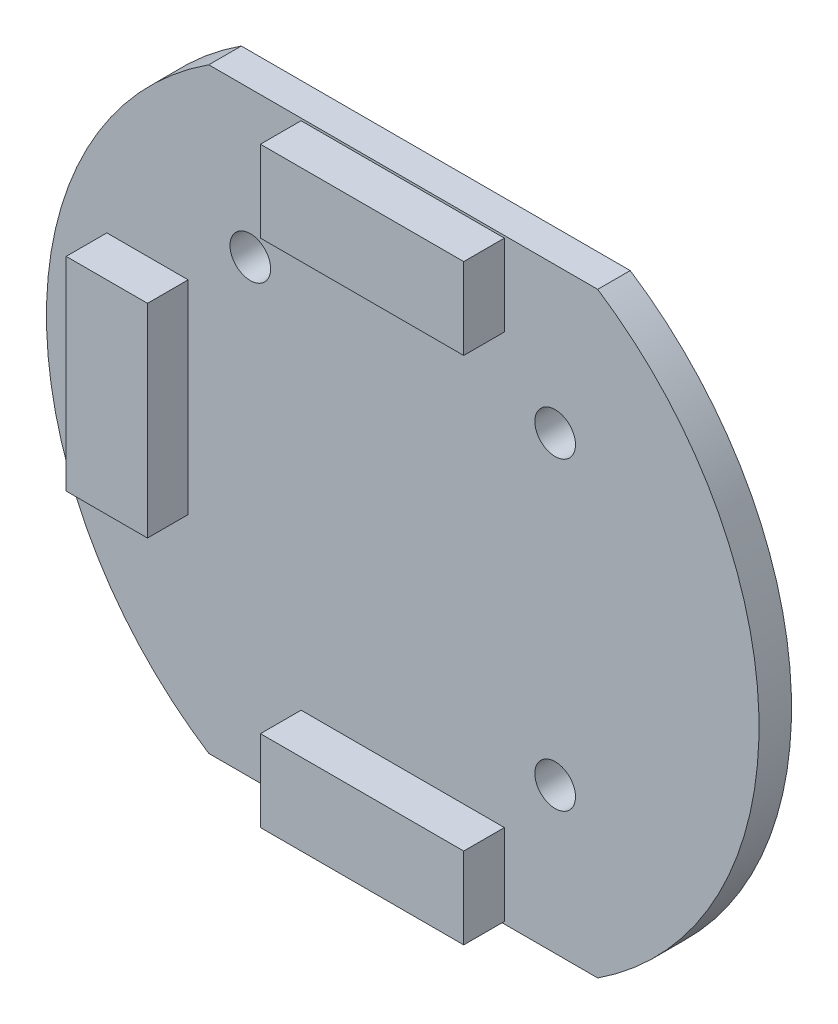
ISO-10303-21;
HEADER;
FILE_DESCRIPTION(('STEP AP214'),'2;1');
FILE_NAME('part.step','',(''),(''),'','','');
FILE_SCHEMA(('AUTOMOTIVE_DESIGN { 1 0 10303 214 1 1 1 1 }'));
ENDSEC;
DATA;
#1=APPLICATION_CONTEXT('core data for automotive mechanical design processes');
#2=APPLICATION_PROTOCOL_DEFINITION('international standard','automotive_design',2000,#1);
#3=PRODUCT_CONTEXT('',#1,'mechanical');
#4=PRODUCT('Part','Part','',(#3));
#5=PRODUCT_RELATED_PRODUCT_CATEGORY('part','',(#4));
#6=PRODUCT_DEFINITION_FORMATION('','',#4);
#7=PRODUCT_DEFINITION_CONTEXT('part definition',#1,'design');
#8=PRODUCT_DEFINITION('design','',#6,#7);
#9=PRODUCT_DEFINITION_SHAPE('','',#8);
#10=(LENGTH_UNIT() NAMED_UNIT(*) SI_UNIT(.MILLI.,.METRE.));
#11=(NAMED_UNIT(*) PLANE_ANGLE_UNIT() SI_UNIT($,.RADIAN.));
#12=(NAMED_UNIT(*) SI_UNIT($,.STERADIAN.) SOLID_ANGLE_UNIT());
#13=UNCERTAINTY_MEASURE_WITH_UNIT(LENGTH_MEASURE(1.E-05),#10,'distance_accuracy_value','');
#14=(GEOMETRIC_REPRESENTATION_CONTEXT(3) GLOBAL_UNCERTAINTY_ASSIGNED_CONTEXT((#13)) GLOBAL_UNIT_ASSIGNED_CONTEXT((#10,
#11,#12)) REPRESENTATION_CONTEXT('',''));
#15=CARTESIAN_POINT('',(0.,0.,0.));
#16=DIRECTION('',(0.,0.,1.));
#17=DIRECTION('',(1.,0.,0.));
#18=AXIS2_PLACEMENT_3D('',#15,#16,#17);
#19=CARTESIAN_POINT('',(-0.0597534019790239,0.,1.6));
#20=DIRECTION('',(0.,0.,1.));
#21=DIRECTION('',(1.,0.,0.));
#22=AXIS2_PLACEMENT_3D('',#19,#20,#21);
#23=PLANE('',#22);
#24=CARTESIAN_POINT('',(-7.49851386109271,7.49851386109278,1.6));
#25=DIRECTION('',(0.,0.,1.));
#26=DIRECTION('',(1.,0.,0.));
#27=AXIS2_PLACEMENT_3D('',#24,#25,#26);
#28=CIRCLE('',#27,1.);
#29=CARTESIAN_POINT('',(-6.49851386109271,7.49851386109278,1.6));
#30=VERTEX_POINT('',#29);
#31=EDGE_CURVE('E345',#30,#30,#28,.T.);
#32=ORIENTED_EDGE('',*,*,#31,.F.);
#33=EDGE_LOOP('',(#32));
#34=FACE_BOUND('',#33,.T.);
#35=CARTESIAN_POINT('',(-0.0597534019790239,0.,1.6));
#36=DIRECTION('',(0.,0.,1.));
#37=DIRECTION('',(1.,0.,0.));
#38=AXIS2_PLACEMENT_3D('',#35,#36,#37);
#39=CIRCLE('',#38,17.466246598021);
#40=CARTESIAN_POINT('',(-9.54157168608882,14.6685,1.6));
#41=VERTEX_POINT('',#40);
#42=CARTESIAN_POINT('',(-9.54157168608882,-14.6685,1.6));
#43=VERTEX_POINT('',#42);
#44=EDGE_CURVE('E361',#41,#43,#39,.T.);
#45=ORIENTED_EDGE('',*,*,#44,.T.);
#46=DIRECTION('',(1.,0.,0.));
#47=VECTOR('',#46,1.);
#48=CARTESIAN_POINT('',(9.59144325688267,-14.6685,1.6));
#49=LINE('',#48,#47);
#50=CARTESIAN_POINT('',(9.59144325688267,-14.6685,1.6));
#51=VERTEX_POINT('',#50);
#52=EDGE_CURVE('E365',#43,#51,#49,.T.);
#53=ORIENTED_EDGE('',*,*,#52,.T.);
#54=CARTESIAN_POINT('',(-3.19189119579733E-13,0.,1.6));
#55=DIRECTION('',(0.,0.,1.));
#56=DIRECTION('',(-1.,0.,0.));
#57=AXIS2_PLACEMENT_3D('',#54,#55,#56);
#58=CIRCLE('',#57,17.5260000000002);
#59=CARTESIAN_POINT('',(9.59144325688267,14.6685,1.6));
#60=VERTEX_POINT('',#59);
#61=EDGE_CURVE('E369',#51,#60,#58,.T.);
#62=ORIENTED_EDGE('',*,*,#61,.T.);
#63=DIRECTION('',(-1.,0.,0.));
#64=VECTOR('',#63,1.);
#65=CARTESIAN_POINT('',(-9.54157168608882,14.6685,1.6));
#66=LINE('',#65,#64);
#67=EDGE_CURVE('E372',#60,#41,#66,.T.);
#68=ORIENTED_EDGE('',*,*,#67,.T.);
#69=EDGE_LOOP('',(#45,#53,#62,#68));
#70=FACE_BOUND('',#69,.T.);
#71=CARTESIAN_POINT('',(7.49851386109276,-7.49851386109273,1.6));
#72=DIRECTION('',(0.,0.,1.));
#73=DIRECTION('',(1.,0.,0.));
#74=AXIS2_PLACEMENT_3D('',#71,#72,#73);
#75=CIRCLE('',#74,1.);
#76=CARTESIAN_POINT('',(8.49851386109276,-7.49851386109273,1.6));
#77=VERTEX_POINT('',#76);
#78=EDGE_CURVE('E353',#77,#77,#75,.T.);
#79=ORIENTED_EDGE('',*,*,#78,.F.);
#80=EDGE_LOOP('',(#79));
#81=FACE_BOUND('',#80,.T.);
#82=CARTESIAN_POINT('',(7.49851386109281,7.49851386109268,1.6));
#83=DIRECTION('',(0.,0.,1.));
#84=DIRECTION('',(1.,0.,0.));
#85=AXIS2_PLACEMENT_3D('',#82,#83,#84);
#86=CIRCLE('',#85,1.);
#87=CARTESIAN_POINT('',(8.49851386109281,7.49851386109268,1.6));
#88=VERTEX_POINT('',#87);
#89=EDGE_CURVE('E337',#88,#88,#86,.T.);
#90=ORIENTED_EDGE('',*,*,#89,.F.);
#91=EDGE_LOOP('',(#90));
#92=FACE_BOUND('',#91,.T.);
#93=DIRECTION('',(1.,0.,0.));
#94=VECTOR('',#93,1.);
#95=CARTESIAN_POINT('',(-5.,-14.555549105909,1.6));
#96=LINE('',#95,#94);
#97=CARTESIAN_POINT('',(-5.,-14.555549105909,1.6));
#98=VERTEX_POINT('',#97);
#99=CARTESIAN_POINT('',(5.,-14.555549105909,1.6));
#100=VERTEX_POINT('',#99);
#101=EDGE_CURVE('E269',#98,#100,#96,.T.);
#102=ORIENTED_EDGE('',*,*,#101,.F.);
#103=DIRECTION('',(0.,-1.,0.));
#104=VECTOR('',#103,1.);
#105=CARTESIAN_POINT('',(-5.,-10.555549105909,1.6));
#106=LINE('',#105,#104);
#107=CARTESIAN_POINT('',(-5.,-10.555549105909,1.6));
#108=VERTEX_POINT('',#107);
#109=EDGE_CURVE('E250',#108,#98,#106,.T.);
#110=ORIENTED_EDGE('',*,*,#109,.F.);
#111=DIRECTION('',(-1.,0.,0.));
#112=VECTOR('',#111,1.);
#113=CARTESIAN_POINT('',(-5.,-10.555549105909,1.6));
#114=LINE('',#113,#112);
#115=CARTESIAN_POINT('',(5.,-10.555549105909,1.6));
#116=VERTEX_POINT('',#115);
#117=EDGE_CURVE('E256',#116,#108,#114,.T.);
#118=ORIENTED_EDGE('',*,*,#117,.F.);
#119=DIRECTION('',(0.,1.,0.));
#120=VECTOR('',#119,1.);
#121=CARTESIAN_POINT('',(5.,-10.555549105909,1.6));
#122=LINE('',#121,#120);
#123=EDGE_CURVE('E272',#100,#116,#122,.T.);
#124=ORIENTED_EDGE('',*,*,#123,.F.);
#125=EDGE_LOOP('',(#102,#110,#118,#124));
#126=FACE_BOUND('',#125,.T.);
#127=DIRECTION('',(-1.,0.,0.));
#128=VECTOR('',#127,1.);
#129=CARTESIAN_POINT('',(-10.555549105909,5.00000000000004,1.6));
#130=LINE('',#129,#128);
#131=CARTESIAN_POINT('',(-10.555549105909,5.00000000000004,1.6));
#132=VERTEX_POINT('',#131);
#133=CARTESIAN_POINT('',(-14.555549105909,5.00000000000005,1.6));
#134=VERTEX_POINT('',#133);
#135=EDGE_CURVE('E211',#132,#134,#130,.T.);
#136=ORIENTED_EDGE('',*,*,#135,.F.);
#137=DIRECTION('',(0.,1.,0.));
#138=VECTOR('',#137,1.);
#139=CARTESIAN_POINT('',(-10.555549105909,5.00000000000004,1.6));
#140=LINE('',#139,#138);
#141=CARTESIAN_POINT('',(-10.555549105909,-4.99999999999996,1.6));
#142=VERTEX_POINT('',#141);
#143=EDGE_CURVE('E206',#142,#132,#140,.T.);
#144=ORIENTED_EDGE('',*,*,#143,.F.);
#145=DIRECTION('',(1.,0.,0.));
#146=VECTOR('',#145,1.);
#147=CARTESIAN_POINT('',(-10.555549105909,-4.99999999999996,1.6));
#148=LINE('',#147,#146);
#149=CARTESIAN_POINT('',(-14.555549105909,-4.99999999999995,1.6));
#150=VERTEX_POINT('',#149);
#151=EDGE_CURVE('E221',#150,#142,#148,.T.);
#152=ORIENTED_EDGE('',*,*,#151,.F.);
#153=DIRECTION('',(0.,-1.,0.));
#154=VECTOR('',#153,1.);
#155=CARTESIAN_POINT('',(-14.555549105909,5.00000000000005,1.6));
#156=LINE('',#155,#154);
#157=EDGE_CURVE('E233',#134,#150,#156,.T.);
#158=ORIENTED_EDGE('',*,*,#157,.F.);
#159=EDGE_LOOP('',(#136,#144,#152,#158));
#160=FACE_BOUND('',#159,.T.);
#161=DIRECTION('',(0.,1.,0.));
#162=VECTOR('',#161,1.);
#163=CARTESIAN_POINT('',(5.00000000000007,10.555549105909,1.6));
#164=LINE('',#163,#162);
#165=CARTESIAN_POINT('',(5.00000000000007,10.555549105909,1.6));
#166=VERTEX_POINT('',#165);
#167=CARTESIAN_POINT('',(5.0000000000001,14.555549105909,1.6));
#168=VERTEX_POINT('',#167);
#169=EDGE_CURVE('E463',#166,#168,#164,.T.);
#170=ORIENTED_EDGE('',*,*,#169,.F.);
#171=DIRECTION('',(1.,0.,0.));
#172=VECTOR('',#171,1.);
#173=CARTESIAN_POINT('',(5.00000000000007,10.555549105909,1.6));
#174=LINE('',#173,#172);
#175=CARTESIAN_POINT('',(-4.99999999999993,10.555549105909,1.6));
#176=VERTEX_POINT('',#175);
#177=EDGE_CURVE('E203',#176,#166,#174,.T.);
#178=ORIENTED_EDGE('',*,*,#177,.F.);
#179=DIRECTION('',(0.,-1.,0.));
#180=VECTOR('',#179,1.);
#181=CARTESIAN_POINT('',(-4.99999999999993,10.555549105909,1.6));
#182=LINE('',#181,#180);
#183=CARTESIAN_POINT('',(-4.9999999999999,14.555549105909,1.6));
#184=VERTEX_POINT('',#183);
#185=EDGE_CURVE('E199',#184,#176,#182,.T.);
#186=ORIENTED_EDGE('',*,*,#185,.F.);
#187=DIRECTION('',(-1.,0.,0.));
#188=VECTOR('',#187,1.);
#189=CARTESIAN_POINT('',(5.0000000000001,14.555549105909,1.6));
#190=LINE('',#189,#188);
#191=EDGE_CURVE('E465',#168,#184,#190,.T.);
#192=ORIENTED_EDGE('',*,*,#191,.F.);
#193=EDGE_LOOP('',(#170,#178,#186,#192));
#194=FACE_BOUND('',#193,.T.);
#195=ADVANCED_FACE('F39',(#34,#70,#81,#92,#126,#160,#194),#23,.T.);
#196=CARTESIAN_POINT('',(-0.0597534019790239,0.,0.));
#197=DIRECTION('',(0.,0.,1.));
#198=DIRECTION('',(1.,0.,0.));
#199=AXIS2_PLACEMENT_3D('',#196,#197,#198);
#200=PLANE('',#199);
#201=CARTESIAN_POINT('',(7.49851386109281,7.49851386109268,0.));
#202=DIRECTION('',(0.,0.,1.));
#203=DIRECTION('',(1.,0.,0.));
#204=AXIS2_PLACEMENT_3D('',#201,#202,#203);
#205=CIRCLE('',#204,1.);
#206=CARTESIAN_POINT('',(8.49851386109281,7.49851386109268,0.));
#207=VERTEX_POINT('',#206);
#208=EDGE_CURVE('E336',#207,#207,#205,.T.);
#209=ORIENTED_EDGE('',*,*,#208,.T.);
#210=EDGE_LOOP('',(#209));
#211=FACE_BOUND('',#210,.T.);
#212=CARTESIAN_POINT('',(-7.49851386109271,7.49851386109278,0.));
#213=DIRECTION('',(0.,0.,1.));
#214=DIRECTION('',(1.,0.,0.));
#215=AXIS2_PLACEMENT_3D('',#212,#213,#214);
#216=CIRCLE('',#215,1.);
#217=CARTESIAN_POINT('',(-6.49851386109271,7.49851386109278,0.));
#218=VERTEX_POINT('',#217);
#219=EDGE_CURVE('E341',#218,#218,#216,.T.);
#220=ORIENTED_EDGE('',*,*,#219,.T.);
#221=EDGE_LOOP('',(#220));
#222=FACE_BOUND('',#221,.T.);
#223=CARTESIAN_POINT('',(7.49851386109276,-7.49851386109273,0.));
#224=DIRECTION('',(0.,0.,1.));
#225=DIRECTION('',(1.,0.,0.));
#226=AXIS2_PLACEMENT_3D('',#223,#224,#225);
#227=CIRCLE('',#226,1.);
#228=CARTESIAN_POINT('',(8.49851386109276,-7.49851386109273,0.));
#229=VERTEX_POINT('',#228);
#230=EDGE_CURVE('E349',#229,#229,#227,.T.);
#231=ORIENTED_EDGE('',*,*,#230,.T.);
#232=EDGE_LOOP('',(#231));
#233=FACE_BOUND('',#232,.T.);
#234=CARTESIAN_POINT('',(-0.0597534019790239,0.,0.));
#235=DIRECTION('',(0.,0.,1.));
#236=DIRECTION('',(1.,0.,0.));
#237=AXIS2_PLACEMENT_3D('',#234,#235,#236);
#238=CIRCLE('',#237,17.466246598021);
#239=CARTESIAN_POINT('',(-9.54157168608882,14.6685,0.));
#240=VERTEX_POINT('',#239);
#241=CARTESIAN_POINT('',(-9.54157168608882,-14.6685,0.));
#242=VERTEX_POINT('',#241);
#243=EDGE_CURVE('E357',#240,#242,#238,.T.);
#244=ORIENTED_EDGE('',*,*,#243,.F.);
#245=DIRECTION('',(-1.,0.,0.));
#246=VECTOR('',#245,1.);
#247=CARTESIAN_POINT('',(-9.54157168608882,14.6685,0.));
#248=LINE('',#247,#246);
#249=CARTESIAN_POINT('',(9.59144325688267,14.6685,0.));
#250=VERTEX_POINT('',#249);
#251=EDGE_CURVE('E366',#250,#240,#248,.T.);
#252=ORIENTED_EDGE('',*,*,#251,.F.);
#253=CARTESIAN_POINT('',(-3.19189119579733E-13,0.,0.));
#254=DIRECTION('',(0.,0.,1.));
#255=DIRECTION('',(-1.,0.,0.));
#256=AXIS2_PLACEMENT_3D('',#253,#254,#255);
#257=CIRCLE('',#256,17.5260000000002);
#258=CARTESIAN_POINT('',(9.59144325688267,-14.6685,0.));
#259=VERTEX_POINT('',#258);
#260=EDGE_CURVE('E382',#259,#250,#257,.T.);
#261=ORIENTED_EDGE('',*,*,#260,.F.);
#262=DIRECTION('',(1.,0.,0.));
#263=VECTOR('',#262,1.);
#264=CARTESIAN_POINT('',(9.59144325688267,-14.6685,0.));
#265=LINE('',#264,#263);
#266=EDGE_CURVE('E379',#242,#259,#265,.T.);
#267=ORIENTED_EDGE('',*,*,#266,.F.);
#268=EDGE_LOOP('',(#244,#252,#261,#267));
#269=FACE_BOUND('',#268,.T.);
#270=DIRECTION('',(0.,1.,0.));
#271=VECTOR('',#270,1.);
#272=CARTESIAN_POINT('',(-0.888689787402086,1.81399359362899,0.));
#273=LINE('',#272,#271);
#274=CARTESIAN_POINT('',(-0.888689787402086,-1.81399359362899,0.));
#275=VERTEX_POINT('',#274);
#276=CARTESIAN_POINT('',(-0.888689787402086,1.81399359362899,0.));
#277=VERTEX_POINT('',#276);
#278=EDGE_CURVE('E291',#275,#277,#273,.T.);
#279=ORIENTED_EDGE('',*,*,#278,.F.);
#280=DIRECTION('',(-1.,0.,0.));
#281=VECTOR('',#280,1.);
#282=CARTESIAN_POINT('',(0.888689787402086,-1.81399359362899,0.));
#283=LINE('',#282,#281);
#284=CARTESIAN_POINT('',(0.888689787402086,-1.81399359362899,0.));
#285=VERTEX_POINT('',#284);
#286=EDGE_CURVE('E297',#285,#275,#283,.T.);
#287=ORIENTED_EDGE('',*,*,#286,.F.);
#288=DIRECTION('',(0.,-1.,0.));
#289=VECTOR('',#288,1.);
#290=CARTESIAN_POINT('',(0.888689787402086,1.81399359362899,0.));
#291=LINE('',#290,#289);
#292=CARTESIAN_POINT('',(0.888689787402086,1.81399359362899,0.));
#293=VERTEX_POINT('',#292);
#294=EDGE_CURVE('E314',#293,#285,#291,.T.);
#295=ORIENTED_EDGE('',*,*,#294,.F.);
#296=DIRECTION('',(1.,0.,0.));
#297=VECTOR('',#296,1.);
#298=CARTESIAN_POINT('',(0.888689787402086,1.81399359362899,0.));
#299=LINE('',#298,#297);
#300=EDGE_CURVE('E310',#277,#293,#299,.T.);
#301=ORIENTED_EDGE('',*,*,#300,.F.);
#302=EDGE_LOOP('',(#279,#287,#295,#301));
#303=FACE_BOUND('',#302,.T.);
#304=ADVANCED_FACE('F405',(#211,#222,#233,#269,#303),#200,.F.);
#305=CARTESIAN_POINT('',(-0.0597534019790239,0.,1.6));
#306=DIRECTION('',(0.,0.,-1.));
#307=DIRECTION('',(-1.,0.,0.));
#308=AXIS2_PLACEMENT_3D('',#305,#306,#307);
#309=CYLINDRICAL_SURFACE('',#308,17.466246598021);
#310=ORIENTED_EDGE('',*,*,#243,.T.);
#311=DIRECTION('',(0.,0.,-1.));
#312=VECTOR('',#311,1.);
#313=CARTESIAN_POINT('',(-9.54157168608882,-14.6685,1.6));
#314=LINE('',#313,#312);
#315=EDGE_CURVE('E11',#43,#242,#314,.T.);
#316=ORIENTED_EDGE('',*,*,#315,.F.);
#317=ORIENTED_EDGE('',*,*,#44,.F.);
#318=DIRECTION('',(0.,0.,-1.));
#319=VECTOR('',#318,1.);
#320=CARTESIAN_POINT('',(-9.54157168608882,14.6685,1.6));
#321=LINE('',#320,#319);
#322=EDGE_CURVE('E375',#41,#240,#321,.T.);
#323=ORIENTED_EDGE('',*,*,#322,.T.);
#324=EDGE_LOOP('',(#310,#316,#317,#323));
#325=FACE_BOUND('',#324,.T.);
#326=ADVANCED_FACE('F41',(#325),#309,.T.);
#327=CARTESIAN_POINT('',(9.59144325688267,-14.6685,1.6));
#328=DIRECTION('',(0.,1.,0.));
#329=DIRECTION('',(0.,0.,1.));
#330=AXIS2_PLACEMENT_3D('',#327,#328,#329);
#331=PLANE('',#330);
#332=ORIENTED_EDGE('',*,*,#266,.T.);
#333=DIRECTION('',(0.,0.,-1.));
#334=VECTOR('',#333,1.);
#335=CARTESIAN_POINT('',(9.59144325688267,-14.6685,1.6));
#336=LINE('',#335,#334);
#337=EDGE_CURVE('E48',#51,#259,#336,.T.);
#338=ORIENTED_EDGE('',*,*,#337,.F.);
#339=ORIENTED_EDGE('',*,*,#52,.F.);
#340=ORIENTED_EDGE('',*,*,#315,.T.);
#341=EDGE_LOOP('',(#332,#338,#339,#340));
#342=FACE_BOUND('',#341,.T.);
#343=ADVANCED_FACE('F416',(#342),#331,.F.);
#344=CARTESIAN_POINT('',(-3.19189119579733E-13,0.,1.6));
#345=DIRECTION('',(0.,0.,-1.));
#346=DIRECTION('',(-1.,0.,0.));
#347=AXIS2_PLACEMENT_3D('',#344,#345,#346);
#348=CYLINDRICAL_SURFACE('',#347,17.5260000000002);
#349=ORIENTED_EDGE('',*,*,#260,.T.);
#350=DIRECTION('',(0.,0.,-1.));
#351=VECTOR('',#350,1.);
#352=CARTESIAN_POINT('',(9.59144325688267,14.6685,1.6));
#353=LINE('',#352,#351);
#354=EDGE_CURVE('E390',#60,#250,#353,.T.);
#355=ORIENTED_EDGE('',*,*,#354,.F.);
#356=ORIENTED_EDGE('',*,*,#61,.F.);
#357=ORIENTED_EDGE('',*,*,#337,.T.);
#358=EDGE_LOOP('',(#349,#355,#356,#357));
#359=FACE_BOUND('',#358,.T.);
#360=ADVANCED_FACE('F399',(#359),#348,.T.);
#361=CARTESIAN_POINT('',(-9.54157168608882,14.6685,1.6));
#362=DIRECTION('',(0.,-1.,0.));
#363=DIRECTION('',(0.,0.,-1.));
#364=AXIS2_PLACEMENT_3D('',#361,#362,#363);
#365=PLANE('',#364);
#366=ORIENTED_EDGE('',*,*,#251,.T.);
#367=ORIENTED_EDGE('',*,*,#322,.F.);
#368=ORIENTED_EDGE('',*,*,#67,.F.);
#369=ORIENTED_EDGE('',*,*,#354,.T.);
#370=EDGE_LOOP('',(#366,#367,#368,#369));
#371=FACE_BOUND('',#370,.T.);
#372=ADVANCED_FACE('F409',(#371),#365,.F.);
#373=CARTESIAN_POINT('',(7.49851386109276,-7.49851386109273,1.6));
#374=DIRECTION('',(0.,0.,-1.));
#375=DIRECTION('',(-1.,0.,0.));
#376=AXIS2_PLACEMENT_3D('',#373,#374,#375);
#377=CYLINDRICAL_SURFACE('',#376,1.);
#378=ORIENTED_EDGE('',*,*,#78,.T.);
#379=EDGE_LOOP('',(#378));
#380=FACE_BOUND('',#379,.T.);
#381=ORIENTED_EDGE('',*,*,#230,.F.);
#382=EDGE_LOOP('',(#381));
#383=FACE_BOUND('',#382,.T.);
#384=ADVANCED_FACE('F433',(#380,#383),#377,.F.);
#385=CARTESIAN_POINT('',(-7.49851386109271,7.49851386109278,1.6));
#386=DIRECTION('',(0.,0.,-1.));
#387=DIRECTION('',(-1.,0.,0.));
#388=AXIS2_PLACEMENT_3D('',#385,#386,#387);
#389=CYLINDRICAL_SURFACE('',#388,1.);
#390=ORIENTED_EDGE('',*,*,#31,.T.);
#391=EDGE_LOOP('',(#390));
#392=FACE_BOUND('',#391,.T.);
#393=ORIENTED_EDGE('',*,*,#219,.F.);
#394=EDGE_LOOP('',(#393));
#395=FACE_BOUND('',#394,.T.);
#396=ADVANCED_FACE('F440',(#392,#395),#389,.F.);
#397=CARTESIAN_POINT('',(7.49851386109281,7.49851386109268,1.6));
#398=DIRECTION('',(0.,0.,-1.));
#399=DIRECTION('',(-1.,0.,0.));
#400=AXIS2_PLACEMENT_3D('',#397,#398,#399);
#401=CYLINDRICAL_SURFACE('',#400,1.);
#402=ORIENTED_EDGE('',*,*,#89,.T.);
#403=EDGE_LOOP('',(#402));
#404=FACE_BOUND('',#403,.T.);
#405=ORIENTED_EDGE('',*,*,#208,.F.);
#406=EDGE_LOOP('',(#405));
#407=FACE_BOUND('',#406,.T.);
#408=ADVANCED_FACE('F445',(#404,#407),#401,.F.);
#409=CARTESIAN_POINT('',(-0.888689787402086,1.81399359362899,-1.7));
#410=DIRECTION('',(1.,0.,0.));
#411=DIRECTION('',(0.,0.,-1.));
#412=AXIS2_PLACEMENT_3D('',#409,#410,#411);
#413=PLANE('',#412);
#414=ORIENTED_EDGE('',*,*,#278,.T.);
#415=DIRECTION('',(0.,0.,1.));
#416=VECTOR('',#415,1.);
#417=CARTESIAN_POINT('',(-0.888689787402086,1.81399359362899,-1.7));
#418=LINE('',#417,#416);
#419=CARTESIAN_POINT('',(-0.888689787402086,1.81399359362899,-1.7));
#420=VERTEX_POINT('',#419);
#421=EDGE_CURVE('E332',#420,#277,#418,.T.);
#422=ORIENTED_EDGE('',*,*,#421,.F.);
#423=DIRECTION('',(0.,1.,0.));
#424=VECTOR('',#423,1.);
#425=CARTESIAN_POINT('',(-0.888689787402086,1.81399359362899,-1.7));
#426=LINE('',#425,#424);
#427=CARTESIAN_POINT('',(-0.888689787402086,-1.81399359362899,-1.7));
#428=VERTEX_POINT('',#427);
#429=EDGE_CURVE('E292',#428,#420,#426,.T.);
#430=ORIENTED_EDGE('',*,*,#429,.F.);
#431=DIRECTION('',(0.,0.,1.));
#432=VECTOR('',#431,1.);
#433=CARTESIAN_POINT('',(-0.888689787402086,-1.81399359362899,-1.7));
#434=LINE('',#433,#432);
#435=EDGE_CURVE('E306',#428,#275,#434,.T.);
#436=ORIENTED_EDGE('',*,*,#435,.T.);
#437=EDGE_LOOP('',(#414,#422,#430,#436));
#438=FACE_BOUND('',#437,.T.);
#439=ADVANCED_FACE('F552',(#438),#413,.F.);
#440=CARTESIAN_POINT('',(0.888689787402086,1.81399359362899,-1.7));
#441=DIRECTION('',(0.,-1.,0.));
#442=DIRECTION('',(0.,0.,-1.));
#443=AXIS2_PLACEMENT_3D('',#440,#441,#442);
#444=PLANE('',#443);
#445=ORIENTED_EDGE('',*,*,#300,.T.);
#446=DIRECTION('',(0.,0.,1.));
#447=VECTOR('',#446,1.);
#448=CARTESIAN_POINT('',(0.888689787402086,1.81399359362899,-1.7));
#449=LINE('',#448,#447);
#450=CARTESIAN_POINT('',(0.888689787402086,1.81399359362899,-1.7));
#451=VERTEX_POINT('',#450);
#452=EDGE_CURVE('E328',#451,#293,#449,.T.);
#453=ORIENTED_EDGE('',*,*,#452,.F.);
#454=DIRECTION('',(1.,0.,0.));
#455=VECTOR('',#454,1.);
#456=CARTESIAN_POINT('',(0.888689787402086,1.81399359362899,-1.7));
#457=LINE('',#456,#455);
#458=EDGE_CURVE('E296',#420,#451,#457,.T.);
#459=ORIENTED_EDGE('',*,*,#458,.F.);
#460=ORIENTED_EDGE('',*,*,#421,.T.);
#461=EDGE_LOOP('',(#445,#453,#459,#460));
#462=FACE_BOUND('',#461,.T.);
#463=ADVANCED_FACE('F548',(#462),#444,.F.);
#464=CARTESIAN_POINT('',(0.888689787402086,1.81399359362899,-1.7));
#465=DIRECTION('',(-1.,0.,0.));
#466=DIRECTION('',(0.,0.,1.));
#467=AXIS2_PLACEMENT_3D('',#464,#465,#466);
#468=PLANE('',#467);
#469=ORIENTED_EDGE('',*,*,#294,.T.);
#470=DIRECTION('',(0.,0.,1.));
#471=VECTOR('',#470,1.);
#472=CARTESIAN_POINT('',(0.888689787402086,-1.81399359362899,-1.7));
#473=LINE('',#472,#471);
#474=CARTESIAN_POINT('',(0.888689787402086,-1.81399359362899,-1.7));
#475=VERTEX_POINT('',#474);
#476=EDGE_CURVE('E324',#475,#285,#473,.T.);
#477=ORIENTED_EDGE('',*,*,#476,.F.);
#478=DIRECTION('',(0.,-1.,0.));
#479=VECTOR('',#478,1.);
#480=CARTESIAN_POINT('',(0.888689787402086,1.81399359362899,-1.7));
#481=LINE('',#480,#479);
#482=EDGE_CURVE('E300',#451,#475,#481,.T.);
#483=ORIENTED_EDGE('',*,*,#482,.F.);
#484=ORIENTED_EDGE('',*,*,#452,.T.);
#485=EDGE_LOOP('',(#469,#477,#483,#484));
#486=FACE_BOUND('',#485,.T.);
#487=ADVANCED_FACE('F544',(#486),#468,.F.);
#488=CARTESIAN_POINT('',(0.888689787402086,-1.81399359362899,-1.7));
#489=DIRECTION('',(0.,1.,0.));
#490=DIRECTION('',(0.,0.,1.));
#491=AXIS2_PLACEMENT_3D('',#488,#489,#490);
#492=PLANE('',#491);
#493=ORIENTED_EDGE('',*,*,#286,.T.);
#494=ORIENTED_EDGE('',*,*,#435,.F.);
#495=DIRECTION('',(-1.,0.,0.));
#496=VECTOR('',#495,1.);
#497=CARTESIAN_POINT('',(0.888689787402086,-1.81399359362899,-1.7));
#498=LINE('',#497,#496);
#499=EDGE_CURVE('E303',#475,#428,#498,.T.);
#500=ORIENTED_EDGE('',*,*,#499,.F.);
#501=ORIENTED_EDGE('',*,*,#476,.T.);
#502=EDGE_LOOP('',(#493,#494,#500,#501));
#503=FACE_BOUND('',#502,.T.);
#504=ADVANCED_FACE('F540',(#503),#492,.F.);
#505=CARTESIAN_POINT('',(0.,0.,-1.7));
#506=DIRECTION('',(0.,0.,-1.));
#507=DIRECTION('',(-1.,0.,0.));
#508=AXIS2_PLACEMENT_3D('',#505,#506,#507);
#509=PLANE('',#508);
#510=ORIENTED_EDGE('',*,*,#429,.T.);
#511=ORIENTED_EDGE('',*,*,#458,.T.);
#512=ORIENTED_EDGE('',*,*,#482,.T.);
#513=ORIENTED_EDGE('',*,*,#499,.T.);
#514=EDGE_LOOP('',(#510,#511,#512,#513));
#515=FACE_BOUND('',#514,.T.);
#516=ADVANCED_FACE('F536',(#515),#509,.T.);
#517=CARTESIAN_POINT('',(-5.,-10.555549105909,3.6));
#518=DIRECTION('',(1.,0.,0.));
#519=DIRECTION('',(0.,0.,-1.));
#520=AXIS2_PLACEMENT_3D('',#517,#518,#519);
#521=PLANE('',#520);
#522=ORIENTED_EDGE('',*,*,#109,.T.);
#523=DIRECTION('',(0.,0.,-1.));
#524=VECTOR('',#523,1.);
#525=CARTESIAN_POINT('',(-5.,-14.555549105909,3.6));
#526=LINE('',#525,#524);
#527=CARTESIAN_POINT('',(-5.,-14.555549105909,3.6));
#528=VERTEX_POINT('',#527);
#529=EDGE_CURVE('E288',#528,#98,#526,.T.);
#530=ORIENTED_EDGE('',*,*,#529,.F.);
#531=DIRECTION('',(0.,-1.,0.));
#532=VECTOR('',#531,1.);
#533=CARTESIAN_POINT('',(-5.,-10.555549105909,3.6));
#534=LINE('',#533,#532);
#535=CARTESIAN_POINT('',(-5.,-10.555549105909,3.6));
#536=VERTEX_POINT('',#535);
#537=EDGE_CURVE('E251',#536,#528,#534,.T.);
#538=ORIENTED_EDGE('',*,*,#537,.F.);
#539=DIRECTION('',(0.,0.,-1.));
#540=VECTOR('',#539,1.);
#541=CARTESIAN_POINT('',(-5.,-10.555549105909,3.6));
#542=LINE('',#541,#540);
#543=EDGE_CURVE('E265',#536,#108,#542,.T.);
#544=ORIENTED_EDGE('',*,*,#543,.T.);
#545=EDGE_LOOP('',(#522,#530,#538,#544));
#546=FACE_BOUND('',#545,.T.);
#547=ADVANCED_FACE('F532',(#546),#521,.F.);
#548=CARTESIAN_POINT('',(-5.,-14.555549105909,3.6));
#549=DIRECTION('',(0.,1.,0.));
#550=DIRECTION('',(-1.,0.,0.));
#551=AXIS2_PLACEMENT_3D('',#548,#549,#550);
#552=PLANE('',#551);
#553=ORIENTED_EDGE('',*,*,#101,.T.);
#554=DIRECTION('',(0.,0.,-1.));
#555=VECTOR('',#554,1.);
#556=CARTESIAN_POINT('',(5.,-14.555549105909,3.6));
#557=LINE('',#556,#555);
#558=CARTESIAN_POINT('',(5.,-14.555549105909,3.6));
#559=VERTEX_POINT('',#558);
#560=EDGE_CURVE('E284',#559,#100,#557,.T.);
#561=ORIENTED_EDGE('',*,*,#560,.F.);
#562=DIRECTION('',(1.,0.,0.));
#563=VECTOR('',#562,1.);
#564=CARTESIAN_POINT('',(-5.,-14.555549105909,3.6));
#565=LINE('',#564,#563);
#566=EDGE_CURVE('E255',#528,#559,#565,.T.);
#567=ORIENTED_EDGE('',*,*,#566,.F.);
#568=ORIENTED_EDGE('',*,*,#529,.T.);
#569=EDGE_LOOP('',(#553,#561,#567,#568));
#570=FACE_BOUND('',#569,.T.);
#571=ADVANCED_FACE('F528',(#570),#552,.F.);
#572=CARTESIAN_POINT('',(5.,-10.555549105909,3.6));
#573=DIRECTION('',(-1.,0.,0.));
#574=DIRECTION('',(0.,-1.,0.));
#575=AXIS2_PLACEMENT_3D('',#572,#573,#574);
#576=PLANE('',#575);
#577=ORIENTED_EDGE('',*,*,#123,.T.);
#578=DIRECTION('',(0.,0.,-1.));
#579=VECTOR('',#578,1.);
#580=CARTESIAN_POINT('',(5.,-10.555549105909,3.6));
#581=LINE('',#580,#579);
#582=CARTESIAN_POINT('',(5.,-10.555549105909,3.6));
#583=VERTEX_POINT('',#582);
#584=EDGE_CURVE('E281',#583,#116,#581,.T.);
#585=ORIENTED_EDGE('',*,*,#584,.F.);
#586=DIRECTION('',(0.,1.,0.));
#587=VECTOR('',#586,1.);
#588=CARTESIAN_POINT('',(5.,-10.555549105909,3.6));
#589=LINE('',#588,#587);
#590=EDGE_CURVE('E259',#559,#583,#589,.T.);
#591=ORIENTED_EDGE('',*,*,#590,.F.);
#592=ORIENTED_EDGE('',*,*,#560,.T.);
#593=EDGE_LOOP('',(#577,#585,#591,#592));
#594=FACE_BOUND('',#593,.T.);
#595=ADVANCED_FACE('F524',(#594),#576,.F.);
#596=CARTESIAN_POINT('',(-5.,-10.555549105909,3.6));
#597=DIRECTION('',(0.,-1.,0.));
#598=DIRECTION('',(1.,0.,0.));
#599=AXIS2_PLACEMENT_3D('',#596,#597,#598);
#600=PLANE('',#599);
#601=ORIENTED_EDGE('',*,*,#117,.T.);
#602=ORIENTED_EDGE('',*,*,#543,.F.);
#603=DIRECTION('',(-1.,0.,0.));
#604=VECTOR('',#603,1.);
#605=CARTESIAN_POINT('',(-5.,-10.555549105909,3.6));
#606=LINE('',#605,#604);
#607=EDGE_CURVE('E262',#583,#536,#606,.T.);
#608=ORIENTED_EDGE('',*,*,#607,.F.);
#609=ORIENTED_EDGE('',*,*,#584,.T.);
#610=EDGE_LOOP('',(#601,#602,#608,#609));
#611=FACE_BOUND('',#610,.T.);
#612=ADVANCED_FACE('F520',(#611),#600,.F.);
#613=CARTESIAN_POINT('',(0.,0.,3.6));
#614=DIRECTION('',(0.,0.,1.));
#615=DIRECTION('',(1.,0.,0.));
#616=AXIS2_PLACEMENT_3D('',#613,#614,#615);
#617=PLANE('',#616);
#618=ORIENTED_EDGE('',*,*,#537,.T.);
#619=ORIENTED_EDGE('',*,*,#566,.T.);
#620=ORIENTED_EDGE('',*,*,#590,.T.);
#621=ORIENTED_EDGE('',*,*,#607,.T.);
#622=EDGE_LOOP('',(#618,#619,#620,#621));
#623=FACE_BOUND('',#622,.T.);
#624=ADVANCED_FACE('F516',(#623),#617,.T.);
#625=CARTESIAN_POINT('',(-10.555549105909,5.00000000000004,3.6));
#626=DIRECTION('',(-1.,0.,0.));
#627=DIRECTION('',(0.,-1.,0.));
#628=AXIS2_PLACEMENT_3D('',#625,#626,#627);
#629=PLANE('',#628);
#630=ORIENTED_EDGE('',*,*,#143,.T.);
#631=DIRECTION('',(0.,0.,-1.));
#632=VECTOR('',#631,1.);
#633=CARTESIAN_POINT('',(-10.555549105909,5.00000000000004,3.6));
#634=LINE('',#633,#632);
#635=CARTESIAN_POINT('',(-10.555549105909,5.00000000000004,3.6));
#636=VERTEX_POINT('',#635);
#637=EDGE_CURVE('E247',#636,#132,#634,.T.);
#638=ORIENTED_EDGE('',*,*,#637,.F.);
#639=DIRECTION('',(0.,1.,0.));
#640=VECTOR('',#639,1.);
#641=CARTESIAN_POINT('',(-10.555549105909,5.00000000000004,3.6));
#642=LINE('',#641,#640);
#643=CARTESIAN_POINT('',(-10.555549105909,-4.99999999999996,3.6));
#644=VERTEX_POINT('',#643);
#645=EDGE_CURVE('E216',#644,#636,#642,.T.);
#646=ORIENTED_EDGE('',*,*,#645,.F.);
#647=DIRECTION('',(0.,0.,-1.));
#648=VECTOR('',#647,1.);
#649=CARTESIAN_POINT('',(-10.555549105909,-4.99999999999996,3.6));
#650=LINE('',#649,#648);
#651=EDGE_CURVE('E229',#644,#142,#650,.T.);
#652=ORIENTED_EDGE('',*,*,#651,.T.);
#653=EDGE_LOOP('',(#630,#638,#646,#652));
#654=FACE_BOUND('',#653,.T.);
#655=ADVANCED_FACE('F512',(#654),#629,.F.);
#656=CARTESIAN_POINT('',(-10.555549105909,5.00000000000004,3.6));
#657=DIRECTION('',(0.,-1.,0.));
#658=DIRECTION('',(1.,0.,0.));
#659=AXIS2_PLACEMENT_3D('',#656,#657,#658);
#660=PLANE('',#659);
#661=ORIENTED_EDGE('',*,*,#135,.T.);
#662=DIRECTION('',(0.,0.,-1.));
#663=VECTOR('',#662,1.);
#664=CARTESIAN_POINT('',(-14.555549105909,5.00000000000005,3.6));
#665=LINE('',#664,#663);
#666=CARTESIAN_POINT('',(-14.555549105909,5.00000000000005,3.6));
#667=VERTEX_POINT('',#666);
#668=EDGE_CURVE('E243',#667,#134,#665,.T.);
#669=ORIENTED_EDGE('',*,*,#668,.F.);
#670=DIRECTION('',(-1.,0.,0.));
#671=VECTOR('',#670,1.);
#672=CARTESIAN_POINT('',(-10.555549105909,5.00000000000004,3.6));
#673=LINE('',#672,#671);
#674=EDGE_CURVE('E220',#636,#667,#673,.T.);
#675=ORIENTED_EDGE('',*,*,#674,.F.);
#676=ORIENTED_EDGE('',*,*,#637,.T.);
#677=EDGE_LOOP('',(#661,#669,#675,#676));
#678=FACE_BOUND('',#677,.T.);
#679=ADVANCED_FACE('F508',(#678),#660,.F.);
#680=CARTESIAN_POINT('',(-14.555549105909,5.00000000000005,3.6));
#681=DIRECTION('',(1.,0.,0.));
#682=DIRECTION('',(0.,1.,0.));
#683=AXIS2_PLACEMENT_3D('',#680,#681,#682);
#684=PLANE('',#683);
#685=ORIENTED_EDGE('',*,*,#157,.T.);
#686=DIRECTION('',(0.,0.,-1.));
#687=VECTOR('',#686,1.);
#688=CARTESIAN_POINT('',(-14.555549105909,-4.99999999999995,3.6));
#689=LINE('',#688,#687);
#690=CARTESIAN_POINT('',(-14.555549105909,-4.99999999999995,3.6));
#691=VERTEX_POINT('',#690);
#692=EDGE_CURVE('E63',#691,#150,#689,.T.);
#693=ORIENTED_EDGE('',*,*,#692,.F.);
#694=DIRECTION('',(0.,-1.,0.));
#695=VECTOR('',#694,1.);
#696=CARTESIAN_POINT('',(-14.555549105909,5.00000000000005,3.6));
#697=LINE('',#696,#695);
#698=EDGE_CURVE('E224',#667,#691,#697,.T.);
#699=ORIENTED_EDGE('',*,*,#698,.F.);
#700=ORIENTED_EDGE('',*,*,#668,.T.);
#701=EDGE_LOOP('',(#685,#693,#699,#700));
#702=FACE_BOUND('',#701,.T.);
#703=ADVANCED_FACE('F505',(#702),#684,.F.);
#704=CARTESIAN_POINT('',(-10.555549105909,-4.99999999999996,3.6));
#705=DIRECTION('',(0.,1.,0.));
#706=DIRECTION('',(-1.,0.,0.));
#707=AXIS2_PLACEMENT_3D('',#704,#705,#706);
#708=PLANE('',#707);
#709=ORIENTED_EDGE('',*,*,#151,.T.);
#710=ORIENTED_EDGE('',*,*,#651,.F.);
#711=DIRECTION('',(1.,0.,0.));
#712=VECTOR('',#711,1.);
#713=CARTESIAN_POINT('',(-10.555549105909,-4.99999999999996,3.6));
#714=LINE('',#713,#712);
#715=EDGE_CURVE('E227',#691,#644,#714,.T.);
#716=ORIENTED_EDGE('',*,*,#715,.F.);
#717=ORIENTED_EDGE('',*,*,#692,.T.);
#718=EDGE_LOOP('',(#709,#710,#716,#717));
#719=FACE_BOUND('',#718,.T.);
#720=ADVANCED_FACE('F501',(#719),#708,.F.);
#721=CARTESIAN_POINT('',(0.,0.,3.6));
#722=DIRECTION('',(0.,0.,-1.));
#723=DIRECTION('',(-1.,0.,0.));
#724=AXIS2_PLACEMENT_3D('',#721,#722,#723);
#725=PLANE('',#724);
#726=ORIENTED_EDGE('',*,*,#645,.T.);
#727=ORIENTED_EDGE('',*,*,#674,.T.);
#728=ORIENTED_EDGE('',*,*,#698,.T.);
#729=ORIENTED_EDGE('',*,*,#715,.T.);
#730=EDGE_LOOP('',(#726,#727,#728,#729));
#731=FACE_BOUND('',#730,.T.);
#732=ADVANCED_FACE('F498',(#731),#725,.F.);
#733=CARTESIAN_POINT('',(5.00000000000007,10.555549105909,3.6));
#734=DIRECTION('',(0.,1.,0.));
#735=DIRECTION('',(-1.,0.,0.));
#736=AXIS2_PLACEMENT_3D('',#733,#734,#735);
#737=PLANE('',#736);
#738=ORIENTED_EDGE('',*,*,#177,.T.);
#739=DIRECTION('',(0.,0.,-1.));
#740=VECTOR('',#739,1.);
#741=CARTESIAN_POINT('',(5.00000000000007,10.555549105909,3.6));
#742=LINE('',#741,#740);
#743=CARTESIAN_POINT('',(5.00000000000007,10.555549105909,3.6));
#744=VERTEX_POINT('',#743);
#745=EDGE_CURVE('E182',#744,#166,#742,.T.);
#746=ORIENTED_EDGE('',*,*,#745,.F.);
#747=DIRECTION('',(1.,0.,0.));
#748=VECTOR('',#747,1.);
#749=CARTESIAN_POINT('',(5.00000000000007,10.555549105909,3.6));
#750=LINE('',#749,#748);
#751=CARTESIAN_POINT('',(-4.99999999999993,10.555549105909,3.6));
#752=VERTEX_POINT('',#751);
#753=EDGE_CURVE('E190',#752,#744,#750,.T.);
#754=ORIENTED_EDGE('',*,*,#753,.F.);
#755=DIRECTION('',(0.,0.,-1.));
#756=VECTOR('',#755,1.);
#757=CARTESIAN_POINT('',(-4.99999999999993,10.555549105909,3.6));
#758=LINE('',#757,#756);
#759=EDGE_CURVE('E476',#752,#176,#758,.T.);
#760=ORIENTED_EDGE('',*,*,#759,.T.);
#761=EDGE_LOOP('',(#738,#746,#754,#760));
#762=FACE_BOUND('',#761,.T.);
#763=ADVANCED_FACE('F201',(#762),#737,.F.);
#764=CARTESIAN_POINT('',(5.00000000000007,10.555549105909,3.6));
#765=DIRECTION('',(-1.,0.,0.));
#766=DIRECTION('',(0.,-1.,0.));
#767=AXIS2_PLACEMENT_3D('',#764,#765,#766);
#768=PLANE('',#767);
#769=ORIENTED_EDGE('',*,*,#169,.T.);
#770=DIRECTION('',(0.,0.,-1.));
#771=VECTOR('',#770,1.);
#772=CARTESIAN_POINT('',(5.0000000000001,14.555549105909,3.6));
#773=LINE('',#772,#771);
#774=CARTESIAN_POINT('',(5.0000000000001,14.555549105909,3.6));
#775=VERTEX_POINT('',#774);
#776=EDGE_CURVE('E185',#775,#168,#773,.T.);
#777=ORIENTED_EDGE('',*,*,#776,.F.);
#778=DIRECTION('',(0.,1.,0.));
#779=VECTOR('',#778,1.);
#780=CARTESIAN_POINT('',(5.00000000000007,10.555549105909,3.6));
#781=LINE('',#780,#779);
#782=EDGE_CURVE('E178',#744,#775,#781,.T.);
#783=ORIENTED_EDGE('',*,*,#782,.F.);
#784=ORIENTED_EDGE('',*,*,#745,.T.);
#785=EDGE_LOOP('',(#769,#777,#783,#784));
#786=FACE_BOUND('',#785,.T.);
#787=ADVANCED_FACE('F180',(#786),#768,.F.);
#788=CARTESIAN_POINT('',(5.0000000000001,14.555549105909,3.6));
#789=DIRECTION('',(0.,-1.,0.));
#790=DIRECTION('',(1.,0.,0.));
#791=AXIS2_PLACEMENT_3D('',#788,#789,#790);
#792=PLANE('',#791);
#793=ORIENTED_EDGE('',*,*,#191,.T.);
#794=DIRECTION('',(0.,0.,-1.));
#795=VECTOR('',#794,1.);
#796=CARTESIAN_POINT('',(-4.9999999999999,14.555549105909,3.6));
#797=LINE('',#796,#795);
#798=CARTESIAN_POINT('',(-4.9999999999999,14.555549105909,3.6));
#799=VERTEX_POINT('',#798);
#800=EDGE_CURVE('E55',#799,#184,#797,.T.);
#801=ORIENTED_EDGE('',*,*,#800,.F.);
#802=DIRECTION('',(-1.,0.,0.));
#803=VECTOR('',#802,1.);
#804=CARTESIAN_POINT('',(5.0000000000001,14.555549105909,3.6));
#805=LINE('',#804,#803);
#806=EDGE_CURVE('E189',#775,#799,#805,.T.);
#807=ORIENTED_EDGE('',*,*,#806,.F.);
#808=ORIENTED_EDGE('',*,*,#776,.T.);
#809=EDGE_LOOP('',(#793,#801,#807,#808));
#810=FACE_BOUND('',#809,.T.);
#811=ADVANCED_FACE('F483',(#810),#792,.F.);
#812=CARTESIAN_POINT('',(-4.99999999999993,10.555549105909,3.6));
#813=DIRECTION('',(1.,0.,0.));
#814=DIRECTION('',(0.,1.,0.));
#815=AXIS2_PLACEMENT_3D('',#812,#813,#814);
#816=PLANE('',#815);
#817=ORIENTED_EDGE('',*,*,#185,.T.);
#818=ORIENTED_EDGE('',*,*,#759,.F.);
#819=DIRECTION('',(0.,-1.,0.));
#820=VECTOR('',#819,1.);
#821=CARTESIAN_POINT('',(-4.99999999999993,10.555549105909,3.6));
#822=LINE('',#821,#820);
#823=EDGE_CURVE('E194',#799,#752,#822,.T.);
#824=ORIENTED_EDGE('',*,*,#823,.F.);
#825=ORIENTED_EDGE('',*,*,#800,.T.);
#826=EDGE_LOOP('',(#817,#818,#824,#825));
#827=FACE_BOUND('',#826,.T.);
#828=ADVANCED_FACE('F484',(#827),#816,.F.);
#829=CARTESIAN_POINT('',(0.,0.,3.6));
#830=DIRECTION('',(0.,0.,-1.));
#831=DIRECTION('',(-1.,0.,0.));
#832=AXIS2_PLACEMENT_3D('',#829,#830,#831);
#833=PLANE('',#832);
#834=ORIENTED_EDGE('',*,*,#753,.T.);
#835=ORIENTED_EDGE('',*,*,#782,.T.);
#836=ORIENTED_EDGE('',*,*,#806,.T.);
#837=ORIENTED_EDGE('',*,*,#823,.T.);
#838=EDGE_LOOP('',(#834,#835,#836,#837));
#839=FACE_BOUND('',#838,.T.);
#840=ADVANCED_FACE('F193',(#839),#833,.F.);
#841=CLOSED_SHELL('',(#195,#304,#326,#343,#360,#372,#384,#396,#408,#439,#463,#487,#504,#516,
#547,#571,#595,#612,#624,#655,#679,#703,#720,#732,#763,#787,#811,#828,#840));
#842=MANIFOLD_SOLID_BREP('B2',#841);
#843=ADVANCED_BREP_SHAPE_REPRESENTATION('',(#18,#842),#14);
#844=SHAPE_DEFINITION_REPRESENTATION(#9,#843);
ENDSEC;
END-ISO-10303-21;
